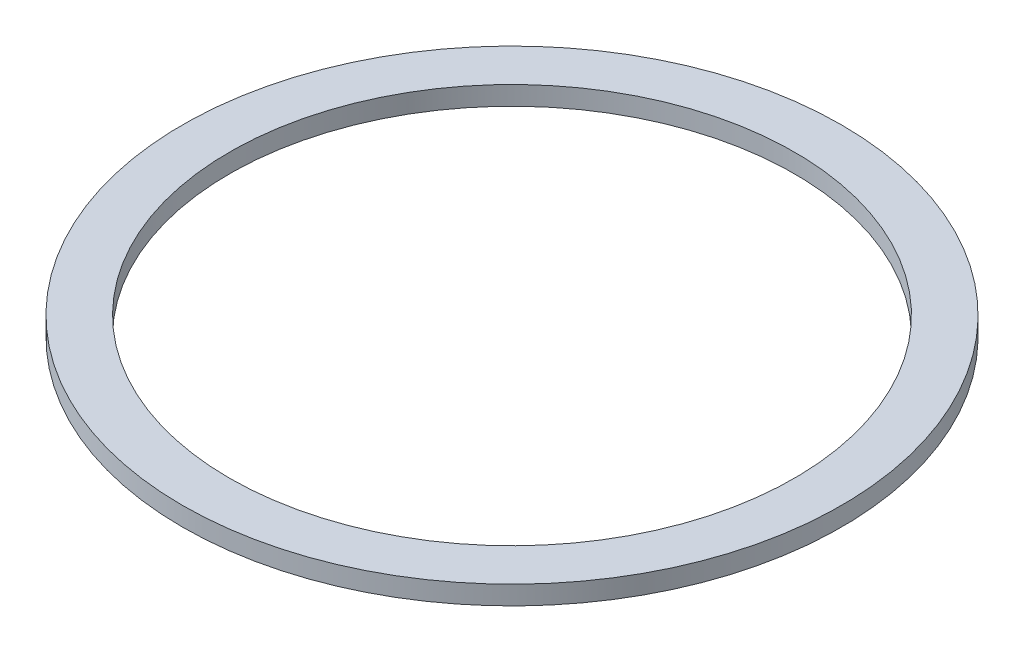
ISO-10303-21;
HEADER;
FILE_DESCRIPTION(('STEP AP214'),'2;1');
FILE_NAME('part.step','',(''),(''),'','','');
FILE_SCHEMA(('AUTOMOTIVE_DESIGN { 1 0 10303 214 1 1 1 1 }'));
ENDSEC;
DATA;
#1=APPLICATION_CONTEXT('core data for automotive mechanical design processes');
#2=APPLICATION_PROTOCOL_DEFINITION('international standard','automotive_design',2000,#1);
#3=PRODUCT_CONTEXT('',#1,'mechanical');
#4=PRODUCT('Part','Part','',(#3));
#5=PRODUCT_RELATED_PRODUCT_CATEGORY('part','',(#4));
#6=PRODUCT_DEFINITION_FORMATION('','',#4);
#7=PRODUCT_DEFINITION_CONTEXT('part definition',#1,'design');
#8=PRODUCT_DEFINITION('design','',#6,#7);
#9=PRODUCT_DEFINITION_SHAPE('','',#8);
#10=(LENGTH_UNIT() NAMED_UNIT(*) SI_UNIT(.MILLI.,.METRE.));
#11=(NAMED_UNIT(*) PLANE_ANGLE_UNIT() SI_UNIT($,.RADIAN.));
#12=(NAMED_UNIT(*) SI_UNIT($,.STERADIAN.) SOLID_ANGLE_UNIT());
#13=UNCERTAINTY_MEASURE_WITH_UNIT(LENGTH_MEASURE(1.E-05),#10,'distance_accuracy_value','');
#14=(GEOMETRIC_REPRESENTATION_CONTEXT(3) GLOBAL_UNCERTAINTY_ASSIGNED_CONTEXT((#13)) GLOBAL_UNIT_ASSIGNED_CONTEXT((#10,
#11,#12)) REPRESENTATION_CONTEXT('',''));
#15=CARTESIAN_POINT('',(0.,0.,0.));
#16=DIRECTION('',(0.,0.,1.));
#17=DIRECTION('',(1.,0.,0.));
#18=AXIS2_PLACEMENT_3D('',#15,#16,#17);
#19=CARTESIAN_POINT('',(0.,1.,0.));
#20=DIRECTION('',(0.,1.,0.));
#21=DIRECTION('',(0.,0.,1.));
#22=AXIS2_PLACEMENT_3D('',#19,#20,#21);
#23=PLANE('',#22);
#24=CARTESIAN_POINT('',(0.,1.,0.));
#25=DIRECTION('',(0.,1.,0.));
#26=DIRECTION('',(0.,0.,1.));
#27=AXIS2_PLACEMENT_3D('',#24,#25,#26);
#28=CIRCLE('',#27,17.5);
#29=CARTESIAN_POINT('',(0.,1.,17.5));
#30=VERTEX_POINT('',#29);
#31=EDGE_CURVE('E10',#30,#30,#28,.T.);
#32=ORIENTED_EDGE('',*,*,#31,.T.);
#33=EDGE_LOOP('',(#32));
#34=FACE_BOUND('',#33,.T.);
#35=CARTESIAN_POINT('',(0.,1.,0.));
#36=DIRECTION('',(0.,1.,0.));
#37=DIRECTION('',(0.,0.,1.));
#38=AXIS2_PLACEMENT_3D('',#35,#36,#37);
#39=CIRCLE('',#38,15.);
#40=CARTESIAN_POINT('',(0.,1.,15.));
#41=VERTEX_POINT('',#40);
#42=EDGE_CURVE('E54',#41,#41,#39,.T.);
#43=ORIENTED_EDGE('',*,*,#42,.F.);
#44=EDGE_LOOP('',(#43));
#45=FACE_BOUND('',#44,.T.);
#46=ADVANCED_FACE('F41',(#34,#45),#23,.T.);
#47=CARTESIAN_POINT('',(0.,0.,0.));
#48=DIRECTION('',(0.,1.,0.));
#49=DIRECTION('',(0.,0.,1.));
#50=AXIS2_PLACEMENT_3D('',#47,#48,#49);
#51=PLANE('',#50);
#52=CARTESIAN_POINT('',(0.,0.,0.));
#53=DIRECTION('',(0.,1.,0.));
#54=DIRECTION('',(0.,0.,1.));
#55=AXIS2_PLACEMENT_3D('',#52,#53,#54);
#56=CIRCLE('',#55,17.5);
#57=CARTESIAN_POINT('',(0.,0.,17.5));
#58=VERTEX_POINT('',#57);
#59=EDGE_CURVE('E45',#58,#58,#56,.T.);
#60=ORIENTED_EDGE('',*,*,#59,.F.);
#61=EDGE_LOOP('',(#60));
#62=FACE_BOUND('',#61,.T.);
#63=CARTESIAN_POINT('',(0.,0.,0.));
#64=DIRECTION('',(0.,1.,0.));
#65=DIRECTION('',(0.,0.,1.));
#66=AXIS2_PLACEMENT_3D('',#63,#64,#65);
#67=CIRCLE('',#66,15.);
#68=CARTESIAN_POINT('',(0.,0.,15.));
#69=VERTEX_POINT('',#68);
#70=EDGE_CURVE('E56',#69,#69,#67,.T.);
#71=ORIENTED_EDGE('',*,*,#70,.T.);
#72=EDGE_LOOP('',(#71));
#73=FACE_BOUND('',#72,.T.);
#74=ADVANCED_FACE('F68',(#62,#73),#51,.F.);
#75=CARTESIAN_POINT('',(0.,1.,0.));
#76=DIRECTION('',(0.,-1.,0.));
#77=DIRECTION('',(0.,0.,-1.));
#78=AXIS2_PLACEMENT_3D('',#75,#76,#77);
#79=CYLINDRICAL_SURFACE('',#78,17.5);
#80=ORIENTED_EDGE('',*,*,#31,.F.);
#81=EDGE_LOOP('',(#80));
#82=FACE_BOUND('',#81,.T.);
#83=ORIENTED_EDGE('',*,*,#59,.T.);
#84=EDGE_LOOP('',(#83));
#85=FACE_BOUND('',#84,.T.);
#86=ADVANCED_FACE('F43',(#82,#85),#79,.T.);
#87=CARTESIAN_POINT('',(0.,1.,0.));
#88=DIRECTION('',(0.,-1.,0.));
#89=DIRECTION('',(0.,0.,-1.));
#90=AXIS2_PLACEMENT_3D('',#87,#88,#89);
#91=CYLINDRICAL_SURFACE('',#90,15.);
#92=ORIENTED_EDGE('',*,*,#42,.T.);
#93=EDGE_LOOP('',(#92));
#94=FACE_BOUND('',#93,.T.);
#95=ORIENTED_EDGE('',*,*,#70,.F.);
#96=EDGE_LOOP('',(#95));
#97=FACE_BOUND('',#96,.T.);
#98=ADVANCED_FACE('F64',(#94,#97),#91,.F.);
#99=CLOSED_SHELL('',(#46,#74,#86,#98));
#100=MANIFOLD_SOLID_BREP('B2',#99);
#101=ADVANCED_BREP_SHAPE_REPRESENTATION('',(#18,#100),#14);
#102=SHAPE_DEFINITION_REPRESENTATION(#9,#101);
ENDSEC;
END-ISO-10303-21;
